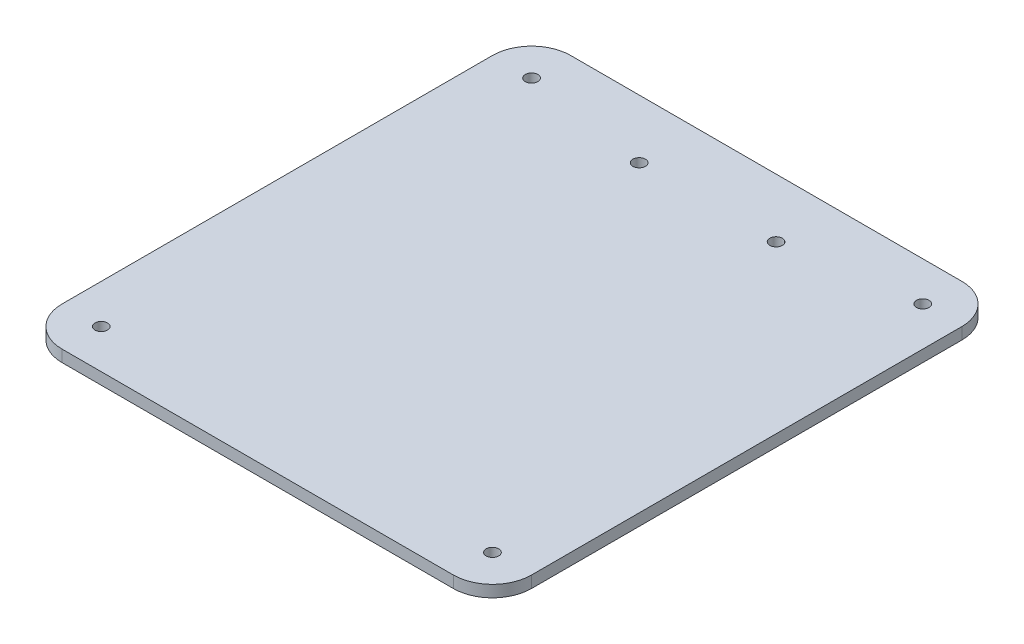
ISO-10303-21;
HEADER;
FILE_DESCRIPTION(('STEP AP214'),'2;1');
FILE_NAME('part.step','',(''),(''),'','','');
FILE_SCHEMA(('AUTOMOTIVE_DESIGN { 1 0 10303 214 1 1 1 1 }'));
ENDSEC;
DATA;
#1=APPLICATION_CONTEXT('core data for automotive mechanical design processes');
#2=APPLICATION_PROTOCOL_DEFINITION('international standard','automotive_design',2000,#1);
#3=PRODUCT_CONTEXT('',#1,'mechanical');
#4=PRODUCT('Part','Part','',(#3));
#5=PRODUCT_RELATED_PRODUCT_CATEGORY('part','',(#4));
#6=PRODUCT_DEFINITION_FORMATION('','',#4);
#7=PRODUCT_DEFINITION_CONTEXT('part definition',#1,'design');
#8=PRODUCT_DEFINITION('design','',#6,#7);
#9=PRODUCT_DEFINITION_SHAPE('','',#8);
#10=(LENGTH_UNIT() NAMED_UNIT(*) SI_UNIT(.MILLI.,.METRE.));
#11=(NAMED_UNIT(*) PLANE_ANGLE_UNIT() SI_UNIT($,.RADIAN.));
#12=(NAMED_UNIT(*) SI_UNIT($,.STERADIAN.) SOLID_ANGLE_UNIT());
#13=UNCERTAINTY_MEASURE_WITH_UNIT(LENGTH_MEASURE(1.E-05),#10,'distance_accuracy_value','');
#14=(GEOMETRIC_REPRESENTATION_CONTEXT(3) GLOBAL_UNCERTAINTY_ASSIGNED_CONTEXT((#13)) GLOBAL_UNIT_ASSIGNED_CONTEXT((#10,
#11,#12)) REPRESENTATION_CONTEXT('',''));
#15=CARTESIAN_POINT('',(0.,0.,0.));
#16=DIRECTION('',(0.,0.,1.));
#17=DIRECTION('',(1.,0.,0.));
#18=AXIS2_PLACEMENT_3D('',#15,#16,#17);
#19=CARTESIAN_POINT('',(-50.,3.,55.));
#20=DIRECTION('',(0.,1.,0.));
#21=DIRECTION('',(0.,0.,1.));
#22=AXIS2_PLACEMENT_3D('',#19,#20,#21);
#23=PLANE('',#22);
#24=CARTESIAN_POINT('',(-17.5,3.,-50.));
#25=DIRECTION('',(0.,1.,0.));
#26=DIRECTION('',(0.,0.,1.));
#27=AXIS2_PLACEMENT_3D('',#24,#25,#26);
#28=CIRCLE('',#27,1.6);
#29=CARTESIAN_POINT('',(-17.5,3.,-48.4));
#30=VERTEX_POINT('',#29);
#31=EDGE_CURVE('E220',#30,#30,#28,.T.);
#32=ORIENTED_EDGE('',*,*,#31,.F.);
#33=EDGE_LOOP('',(#32));
#34=FACE_BOUND('',#33,.T.);
#35=CARTESIAN_POINT('',(17.5,3.,-50.));
#36=DIRECTION('',(0.,1.,0.));
#37=DIRECTION('',(0.,0.,1.));
#38=AXIS2_PLACEMENT_3D('',#35,#36,#37);
#39=CIRCLE('',#38,1.6);
#40=CARTESIAN_POINT('',(17.5,3.,-48.4));
#41=VERTEX_POINT('',#40);
#42=EDGE_CURVE('E217',#41,#41,#39,.T.);
#43=ORIENTED_EDGE('',*,*,#42,.F.);
#44=EDGE_LOOP('',(#43));
#45=FACE_BOUND('',#44,.T.);
#46=CARTESIAN_POINT('',(50.,3.,55.));
#47=DIRECTION('',(0.,1.,0.));
#48=DIRECTION('',(0.,0.,-1.));
#49=AXIS2_PLACEMENT_3D('',#46,#47,#48);
#50=CIRCLE('',#49,1.60000000000001);
#51=CARTESIAN_POINT('',(50.,3.,53.4));
#52=VERTEX_POINT('',#51);
#53=EDGE_CURVE('E199',#52,#52,#50,.T.);
#54=ORIENTED_EDGE('',*,*,#53,.F.);
#55=EDGE_LOOP('',(#54));
#56=FACE_BOUND('',#55,.T.);
#57=CARTESIAN_POINT('',(50.,3.,-55.));
#58=DIRECTION('',(0.,1.,0.));
#59=DIRECTION('',(0.,0.,1.));
#60=AXIS2_PLACEMENT_3D('',#57,#58,#59);
#61=CIRCLE('',#60,1.6);
#62=CARTESIAN_POINT('',(50.,3.,-53.4));
#63=VERTEX_POINT('',#62);
#64=EDGE_CURVE('E145',#63,#63,#61,.T.);
#65=ORIENTED_EDGE('',*,*,#64,.F.);
#66=EDGE_LOOP('',(#65));
#67=FACE_BOUND('',#66,.T.);
#68=CARTESIAN_POINT('',(-50.,3.,55.));
#69=DIRECTION('',(0.,1.,0.));
#70=DIRECTION('',(0.,0.,1.));
#71=AXIS2_PLACEMENT_3D('',#68,#69,#70);
#72=CIRCLE('',#71,9.99999999999999);
#73=CARTESIAN_POINT('',(-60.,3.,54.9999999999999));
#74=VERTEX_POINT('',#73);
#75=CARTESIAN_POINT('',(-49.9999999999999,3.,65.));
#76=VERTEX_POINT('',#75);
#77=EDGE_CURVE('E156',#74,#76,#72,.T.);
#78=ORIENTED_EDGE('',*,*,#77,.T.);
#79=DIRECTION('',(1.,0.,0.));
#80=VECTOR('',#79,1.);
#81=CARTESIAN_POINT('',(-49.9999999999999,3.,65.));
#82=LINE('',#81,#80);
#83=CARTESIAN_POINT('',(49.9999999999999,3.,65.));
#84=VERTEX_POINT('',#83);
#85=EDGE_CURVE('E104',#76,#84,#82,.T.);
#86=ORIENTED_EDGE('',*,*,#85,.T.);
#87=CARTESIAN_POINT('',(50.,3.,55.));
#88=DIRECTION('',(0.,1.,0.));
#89=DIRECTION('',(0.,0.,1.));
#90=AXIS2_PLACEMENT_3D('',#87,#88,#89);
#91=CIRCLE('',#90,9.99999999999999);
#92=CARTESIAN_POINT('',(60.,3.,54.9999999999999));
#93=VERTEX_POINT('',#92);
#94=EDGE_CURVE('E171',#84,#93,#91,.T.);
#95=ORIENTED_EDGE('',*,*,#94,.T.);
#96=DIRECTION('',(0.,0.,-1.));
#97=VECTOR('',#96,1.);
#98=CARTESIAN_POINT('',(60.,3.,-54.9999999999999));
#99=LINE('',#98,#97);
#100=CARTESIAN_POINT('',(60.,3.,-54.9999999999999));
#101=VERTEX_POINT('',#100);
#102=EDGE_CURVE('E184',#93,#101,#99,.T.);
#103=ORIENTED_EDGE('',*,*,#102,.T.);
#104=CARTESIAN_POINT('',(50.,3.,-55.));
#105=DIRECTION('',(0.,1.,0.));
#106=DIRECTION('',(0.,0.,-1.));
#107=AXIS2_PLACEMENT_3D('',#104,#105,#106);
#108=CIRCLE('',#107,9.99999999999999);
#109=CARTESIAN_POINT('',(49.9999999999999,3.,-65.));
#110=VERTEX_POINT('',#109);
#111=EDGE_CURVE('E123',#101,#110,#108,.T.);
#112=ORIENTED_EDGE('',*,*,#111,.T.);
#113=DIRECTION('',(-1.,0.,0.));
#114=VECTOR('',#113,1.);
#115=CARTESIAN_POINT('',(-49.9999999999999,3.,-65.));
#116=LINE('',#115,#114);
#117=CARTESIAN_POINT('',(-49.9999999999999,3.,-65.));
#118=VERTEX_POINT('',#117);
#119=EDGE_CURVE('E117',#110,#118,#116,.T.);
#120=ORIENTED_EDGE('',*,*,#119,.T.);
#121=CARTESIAN_POINT('',(-50.,3.,-55.));
#122=DIRECTION('',(0.,1.,0.));
#123=DIRECTION('',(0.,0.,1.));
#124=AXIS2_PLACEMENT_3D('',#121,#122,#123);
#125=CIRCLE('',#124,9.99999999999999);
#126=CARTESIAN_POINT('',(-60.,3.,-54.9999999999999));
#127=VERTEX_POINT('',#126);
#128=EDGE_CURVE('E121',#118,#127,#125,.T.);
#129=ORIENTED_EDGE('',*,*,#128,.T.);
#130=DIRECTION('',(0.,0.,1.));
#131=VECTOR('',#130,1.);
#132=CARTESIAN_POINT('',(-60.,3.,-54.9999999999999));
#133=LINE('',#132,#131);
#134=EDGE_CURVE('E61',#127,#74,#133,.T.);
#135=ORIENTED_EDGE('',*,*,#134,.T.);
#136=EDGE_LOOP('',(#78,#86,#95,#103,#112,#120,#129,#135));
#137=FACE_BOUND('',#136,.T.);
#138=CARTESIAN_POINT('',(-50.,3.,-55.));
#139=DIRECTION('',(0.,1.,0.));
#140=DIRECTION('',(0.,0.,-1.));
#141=AXIS2_PLACEMENT_3D('',#138,#139,#140);
#142=CIRCLE('',#141,1.59999999999999);
#143=CARTESIAN_POINT('',(-50.,3.,-56.6));
#144=VERTEX_POINT('',#143);
#145=EDGE_CURVE('E193',#144,#144,#142,.T.);
#146=ORIENTED_EDGE('',*,*,#145,.F.);
#147=EDGE_LOOP('',(#146));
#148=FACE_BOUND('',#147,.T.);
#149=CARTESIAN_POINT('',(-50.,3.,55.));
#150=DIRECTION('',(0.,1.,0.));
#151=DIRECTION('',(0.,0.,1.));
#152=AXIS2_PLACEMENT_3D('',#149,#150,#151);
#153=CIRCLE('',#152,1.6);
#154=CARTESIAN_POINT('',(-50.,3.,56.6));
#155=VERTEX_POINT('',#154);
#156=EDGE_CURVE('E205',#155,#155,#153,.T.);
#157=ORIENTED_EDGE('',*,*,#156,.F.);
#158=EDGE_LOOP('',(#157));
#159=FACE_BOUND('',#158,.T.);
#160=ADVANCED_FACE('F44',(#34,#45,#56,#67,#137,#148,#159),#23,.T.);
#161=CARTESIAN_POINT('',(-50.,0.,55.));
#162=DIRECTION('',(0.,1.,0.));
#163=DIRECTION('',(0.,0.,1.));
#164=AXIS2_PLACEMENT_3D('',#161,#162,#163);
#165=PLANE('',#164);
#166=CARTESIAN_POINT('',(-17.5,0.,-50.));
#167=DIRECTION('',(0.,1.,0.));
#168=DIRECTION('',(0.,0.,1.));
#169=AXIS2_PLACEMENT_3D('',#166,#167,#168);
#170=CIRCLE('',#169,1.6);
#171=CARTESIAN_POINT('',(-17.5,0.,-48.4));
#172=VERTEX_POINT('',#171);
#173=EDGE_CURVE('E211',#172,#172,#170,.T.);
#174=ORIENTED_EDGE('',*,*,#173,.T.);
#175=EDGE_LOOP('',(#174));
#176=FACE_BOUND('',#175,.T.);
#177=CARTESIAN_POINT('',(17.5,0.,-50.));
#178=DIRECTION('',(0.,1.,0.));
#179=DIRECTION('',(0.,0.,1.));
#180=AXIS2_PLACEMENT_3D('',#177,#178,#179);
#181=CIRCLE('',#180,1.6);
#182=CARTESIAN_POINT('',(17.5,0.,-48.4));
#183=VERTEX_POINT('',#182);
#184=EDGE_CURVE('E214',#183,#183,#181,.T.);
#185=ORIENTED_EDGE('',*,*,#184,.T.);
#186=EDGE_LOOP('',(#185));
#187=FACE_BOUND('',#186,.T.);
#188=CARTESIAN_POINT('',(-50.,0.,55.));
#189=DIRECTION('',(0.,1.,0.));
#190=DIRECTION('',(0.,0.,1.));
#191=AXIS2_PLACEMENT_3D('',#188,#189,#190);
#192=CIRCLE('',#191,9.99999999999999);
#193=CARTESIAN_POINT('',(-60.,0.,54.9999999999999));
#194=VERTEX_POINT('',#193);
#195=CARTESIAN_POINT('',(-49.9999999999999,0.,65.));
#196=VERTEX_POINT('',#195);
#197=EDGE_CURVE('E141',#194,#196,#192,.T.);
#198=ORIENTED_EDGE('',*,*,#197,.F.);
#199=DIRECTION('',(0.,0.,1.));
#200=VECTOR('',#199,1.);
#201=CARTESIAN_POINT('',(-60.,0.,-54.9999999999999));
#202=LINE('',#201,#200);
#203=CARTESIAN_POINT('',(-60.,0.,-54.9999999999999));
#204=VERTEX_POINT('',#203);
#205=EDGE_CURVE('E96',#204,#194,#202,.T.);
#206=ORIENTED_EDGE('',*,*,#205,.F.);
#207=CARTESIAN_POINT('',(-50.,0.,-55.));
#208=DIRECTION('',(0.,1.,0.));
#209=DIRECTION('',(0.,0.,1.));
#210=AXIS2_PLACEMENT_3D('',#207,#208,#209);
#211=CIRCLE('',#210,9.99999999999999);
#212=CARTESIAN_POINT('',(-49.9999999999999,0.,-65.));
#213=VERTEX_POINT('',#212);
#214=EDGE_CURVE('E90',#213,#204,#211,.T.);
#215=ORIENTED_EDGE('',*,*,#214,.F.);
#216=DIRECTION('',(-1.,0.,0.));
#217=VECTOR('',#216,1.);
#218=CARTESIAN_POINT('',(-49.9999999999999,0.,-65.));
#219=LINE('',#218,#217);
#220=CARTESIAN_POINT('',(49.9999999999999,0.,-65.));
#221=VERTEX_POINT('',#220);
#222=EDGE_CURVE('E131',#221,#213,#219,.T.);
#223=ORIENTED_EDGE('',*,*,#222,.F.);
#224=CARTESIAN_POINT('',(50.,0.,-55.));
#225=DIRECTION('',(0.,1.,0.));
#226=DIRECTION('',(0.,0.,-1.));
#227=AXIS2_PLACEMENT_3D('',#224,#225,#226);
#228=CIRCLE('',#227,9.99999999999999);
#229=CARTESIAN_POINT('',(60.,0.,-54.9999999999999));
#230=VERTEX_POINT('',#229);
#231=EDGE_CURVE('E151',#230,#221,#228,.T.);
#232=ORIENTED_EDGE('',*,*,#231,.F.);
#233=DIRECTION('',(0.,0.,-1.));
#234=VECTOR('',#233,1.);
#235=CARTESIAN_POINT('',(60.,0.,-54.9999999999999));
#236=LINE('',#235,#234);
#237=CARTESIAN_POINT('',(60.,0.,54.9999999999999));
#238=VERTEX_POINT('',#237);
#239=EDGE_CURVE('E149',#238,#230,#236,.T.);
#240=ORIENTED_EDGE('',*,*,#239,.F.);
#241=CARTESIAN_POINT('',(50.,0.,55.));
#242=DIRECTION('',(0.,1.,0.));
#243=DIRECTION('',(0.,0.,1.));
#244=AXIS2_PLACEMENT_3D('',#241,#242,#243);
#245=CIRCLE('',#244,9.99999999999999);
#246=CARTESIAN_POINT('',(49.9999999999999,0.,65.));
#247=VERTEX_POINT('',#246);
#248=EDGE_CURVE('E147',#247,#238,#245,.T.);
#249=ORIENTED_EDGE('',*,*,#248,.F.);
#250=DIRECTION('',(1.,0.,0.));
#251=VECTOR('',#250,1.);
#252=CARTESIAN_POINT('',(-49.9999999999999,0.,65.));
#253=LINE('',#252,#251);
#254=EDGE_CURVE('E144',#196,#247,#253,.T.);
#255=ORIENTED_EDGE('',*,*,#254,.F.);
#256=EDGE_LOOP('',(#198,#206,#215,#223,#232,#240,#249,#255));
#257=FACE_BOUND('',#256,.T.);
#258=CARTESIAN_POINT('',(50.,0.,-55.));
#259=DIRECTION('',(0.,1.,0.));
#260=DIRECTION('',(0.,0.,1.));
#261=AXIS2_PLACEMENT_3D('',#258,#259,#260);
#262=CIRCLE('',#261,1.6);
#263=CARTESIAN_POINT('',(50.,0.,-53.4));
#264=VERTEX_POINT('',#263);
#265=EDGE_CURVE('E190',#264,#264,#262,.T.);
#266=ORIENTED_EDGE('',*,*,#265,.T.);
#267=EDGE_LOOP('',(#266));
#268=FACE_BOUND('',#267,.T.);
#269=CARTESIAN_POINT('',(-50.,0.,-55.));
#270=DIRECTION('',(0.,1.,0.));
#271=DIRECTION('',(0.,0.,-1.));
#272=AXIS2_PLACEMENT_3D('',#269,#270,#271);
#273=CIRCLE('',#272,1.59999999999999);
#274=CARTESIAN_POINT('',(-50.,0.,-56.6));
#275=VERTEX_POINT('',#274);
#276=EDGE_CURVE('E196',#275,#275,#273,.T.);
#277=ORIENTED_EDGE('',*,*,#276,.T.);
#278=EDGE_LOOP('',(#277));
#279=FACE_BOUND('',#278,.T.);
#280=CARTESIAN_POINT('',(50.,0.,55.));
#281=DIRECTION('',(0.,1.,0.));
#282=DIRECTION('',(0.,0.,-1.));
#283=AXIS2_PLACEMENT_3D('',#280,#281,#282);
#284=CIRCLE('',#283,1.60000000000001);
#285=CARTESIAN_POINT('',(50.,0.,53.4));
#286=VERTEX_POINT('',#285);
#287=EDGE_CURVE('E202',#286,#286,#284,.T.);
#288=ORIENTED_EDGE('',*,*,#287,.T.);
#289=EDGE_LOOP('',(#288));
#290=FACE_BOUND('',#289,.T.);
#291=CARTESIAN_POINT('',(-50.,0.,55.));
#292=DIRECTION('',(0.,1.,0.));
#293=DIRECTION('',(0.,0.,1.));
#294=AXIS2_PLACEMENT_3D('',#291,#292,#293);
#295=CIRCLE('',#294,1.6);
#296=CARTESIAN_POINT('',(-50.,0.,56.6));
#297=VERTEX_POINT('',#296);
#298=EDGE_CURVE('E208',#297,#297,#295,.T.);
#299=ORIENTED_EDGE('',*,*,#298,.T.);
#300=EDGE_LOOP('',(#299));
#301=FACE_BOUND('',#300,.T.);
#302=ADVANCED_FACE('F175',(#176,#187,#257,#268,#279,#290,#301),#165,.F.);
#303=CARTESIAN_POINT('',(-50.,3.,55.));
#304=DIRECTION('',(0.,-1.,0.));
#305=DIRECTION('',(0.,0.,-1.));
#306=AXIS2_PLACEMENT_3D('',#303,#304,#305);
#307=CYLINDRICAL_SURFACE('',#306,9.99999999999999);
#308=ORIENTED_EDGE('',*,*,#197,.T.);
#309=DIRECTION('',(0.,-1.,0.));
#310=VECTOR('',#309,1.);
#311=CARTESIAN_POINT('',(-49.9999999999999,3.,65.));
#312=LINE('',#311,#310);
#313=EDGE_CURVE('E11',#76,#196,#312,.T.);
#314=ORIENTED_EDGE('',*,*,#313,.F.);
#315=ORIENTED_EDGE('',*,*,#77,.F.);
#316=DIRECTION('',(0.,-1.,0.));
#317=VECTOR('',#316,1.);
#318=CARTESIAN_POINT('',(-60.,3.,54.9999999999999));
#319=LINE('',#318,#317);
#320=EDGE_CURVE('E137',#74,#194,#319,.T.);
#321=ORIENTED_EDGE('',*,*,#320,.T.);
#322=EDGE_LOOP('',(#308,#314,#315,#321));
#323=FACE_BOUND('',#322,.T.);
#324=ADVANCED_FACE('F46',(#323),#307,.T.);
#325=CARTESIAN_POINT('',(-49.9999999999999,3.,65.));
#326=DIRECTION('',(0.,0.,-1.));
#327=DIRECTION('',(-1.,0.,0.));
#328=AXIS2_PLACEMENT_3D('',#325,#326,#327);
#329=PLANE('',#328);
#330=ORIENTED_EDGE('',*,*,#254,.T.);
#331=DIRECTION('',(0.,-1.,0.));
#332=VECTOR('',#331,1.);
#333=CARTESIAN_POINT('',(49.9999999999999,3.,65.));
#334=LINE('',#333,#332);
#335=EDGE_CURVE('E53',#84,#247,#334,.T.);
#336=ORIENTED_EDGE('',*,*,#335,.F.);
#337=ORIENTED_EDGE('',*,*,#85,.F.);
#338=ORIENTED_EDGE('',*,*,#313,.T.);
#339=EDGE_LOOP('',(#330,#336,#337,#338));
#340=FACE_BOUND('',#339,.T.);
#341=ADVANCED_FACE('F288',(#340),#329,.F.);
#342=CARTESIAN_POINT('',(50.,3.,55.));
#343=DIRECTION('',(0.,-1.,0.));
#344=DIRECTION('',(0.,0.,-1.));
#345=AXIS2_PLACEMENT_3D('',#342,#343,#344);
#346=CYLINDRICAL_SURFACE('',#345,9.99999999999999);
#347=ORIENTED_EDGE('',*,*,#248,.T.);
#348=DIRECTION('',(0.,-1.,0.));
#349=VECTOR('',#348,1.);
#350=CARTESIAN_POINT('',(60.,3.,54.9999999999999));
#351=LINE('',#350,#349);
#352=EDGE_CURVE('E163',#93,#238,#351,.T.);
#353=ORIENTED_EDGE('',*,*,#352,.F.);
#354=ORIENTED_EDGE('',*,*,#94,.F.);
#355=ORIENTED_EDGE('',*,*,#335,.T.);
#356=EDGE_LOOP('',(#347,#353,#354,#355));
#357=FACE_BOUND('',#356,.T.);
#358=ADVANCED_FACE('F169',(#357),#346,.T.);
#359=CARTESIAN_POINT('',(60.,3.,-54.9999999999999));
#360=DIRECTION('',(-1.,0.,0.));
#361=DIRECTION('',(0.,0.,1.));
#362=AXIS2_PLACEMENT_3D('',#359,#360,#361);
#363=PLANE('',#362);
#364=ORIENTED_EDGE('',*,*,#239,.T.);
#365=DIRECTION('',(0.,-1.,0.));
#366=VECTOR('',#365,1.);
#367=CARTESIAN_POINT('',(60.,3.,-54.9999999999999));
#368=LINE('',#367,#366);
#369=EDGE_CURVE('E160',#101,#230,#368,.T.);
#370=ORIENTED_EDGE('',*,*,#369,.F.);
#371=ORIENTED_EDGE('',*,*,#102,.F.);
#372=ORIENTED_EDGE('',*,*,#352,.T.);
#373=EDGE_LOOP('',(#364,#370,#371,#372));
#374=FACE_BOUND('',#373,.T.);
#375=ADVANCED_FACE('F180',(#374),#363,.F.);
#376=CARTESIAN_POINT('',(50.,3.,-55.));
#377=DIRECTION('',(0.,-1.,0.));
#378=DIRECTION('',(0.,0.,-1.));
#379=AXIS2_PLACEMENT_3D('',#376,#377,#378);
#380=CYLINDRICAL_SURFACE('',#379,9.99999999999999);
#381=ORIENTED_EDGE('',*,*,#231,.T.);
#382=DIRECTION('',(0.,-1.,0.));
#383=VECTOR('',#382,1.);
#384=CARTESIAN_POINT('',(49.9999999999999,3.,-65.));
#385=LINE('',#384,#383);
#386=EDGE_CURVE('E132',#110,#221,#385,.T.);
#387=ORIENTED_EDGE('',*,*,#386,.F.);
#388=ORIENTED_EDGE('',*,*,#111,.F.);
#389=ORIENTED_EDGE('',*,*,#369,.T.);
#390=EDGE_LOOP('',(#381,#387,#388,#389));
#391=FACE_BOUND('',#390,.T.);
#392=ADVANCED_FACE('F183',(#391),#380,.T.);
#393=CARTESIAN_POINT('',(-49.9999999999999,3.,-65.));
#394=DIRECTION('',(0.,0.,1.));
#395=DIRECTION('',(1.,0.,0.));
#396=AXIS2_PLACEMENT_3D('',#393,#394,#395);
#397=PLANE('',#396);
#398=ORIENTED_EDGE('',*,*,#222,.T.);
#399=DIRECTION('',(0.,-1.,0.));
#400=VECTOR('',#399,1.);
#401=CARTESIAN_POINT('',(-49.9999999999999,3.,-65.));
#402=LINE('',#401,#400);
#403=EDGE_CURVE('E128',#118,#213,#402,.T.);
#404=ORIENTED_EDGE('',*,*,#403,.F.);
#405=ORIENTED_EDGE('',*,*,#119,.F.);
#406=ORIENTED_EDGE('',*,*,#386,.T.);
#407=EDGE_LOOP('',(#398,#404,#405,#406));
#408=FACE_BOUND('',#407,.T.);
#409=ADVANCED_FACE('F129',(#408),#397,.F.);
#410=CARTESIAN_POINT('',(-50.,3.,-55.));
#411=DIRECTION('',(0.,-1.,0.));
#412=DIRECTION('',(0.,0.,-1.));
#413=AXIS2_PLACEMENT_3D('',#410,#411,#412);
#414=CYLINDRICAL_SURFACE('',#413,9.99999999999999);
#415=ORIENTED_EDGE('',*,*,#214,.T.);
#416=DIRECTION('',(0.,-1.,0.));
#417=VECTOR('',#416,1.);
#418=CARTESIAN_POINT('',(-60.,3.,-54.9999999999999));
#419=LINE('',#418,#417);
#420=EDGE_CURVE('E133',#127,#204,#419,.T.);
#421=ORIENTED_EDGE('',*,*,#420,.F.);
#422=ORIENTED_EDGE('',*,*,#128,.F.);
#423=ORIENTED_EDGE('',*,*,#403,.T.);
#424=EDGE_LOOP('',(#415,#421,#422,#423));
#425=FACE_BOUND('',#424,.T.);
#426=ADVANCED_FACE('F135',(#425),#414,.T.);
#427=CARTESIAN_POINT('',(-60.,3.,-54.9999999999999));
#428=DIRECTION('',(1.,0.,0.));
#429=DIRECTION('',(0.,0.,-1.));
#430=AXIS2_PLACEMENT_3D('',#427,#428,#429);
#431=PLANE('',#430);
#432=ORIENTED_EDGE('',*,*,#205,.T.);
#433=ORIENTED_EDGE('',*,*,#320,.F.);
#434=ORIENTED_EDGE('',*,*,#134,.F.);
#435=ORIENTED_EDGE('',*,*,#420,.T.);
#436=EDGE_LOOP('',(#432,#433,#434,#435));
#437=FACE_BOUND('',#436,.T.);
#438=ADVANCED_FACE('F248',(#437),#431,.F.);
#439=CARTESIAN_POINT('',(50.,3.,-55.));
#440=DIRECTION('',(0.,-1.,0.));
#441=DIRECTION('',(0.,0.,-1.));
#442=AXIS2_PLACEMENT_3D('',#439,#440,#441);
#443=CYLINDRICAL_SURFACE('',#442,1.6);
#444=ORIENTED_EDGE('',*,*,#64,.T.);
#445=EDGE_LOOP('',(#444));
#446=FACE_BOUND('',#445,.T.);
#447=ORIENTED_EDGE('',*,*,#265,.F.);
#448=EDGE_LOOP('',(#447));
#449=FACE_BOUND('',#448,.T.);
#450=ADVANCED_FACE('F244',(#446,#449),#443,.F.);
#451=CARTESIAN_POINT('',(-50.,3.,-55.));
#452=DIRECTION('',(0.,-1.,0.));
#453=DIRECTION('',(0.,0.,-1.));
#454=AXIS2_PLACEMENT_3D('',#451,#452,#453);
#455=CYLINDRICAL_SURFACE('',#454,1.59999999999999);
#456=ORIENTED_EDGE('',*,*,#145,.T.);
#457=EDGE_LOOP('',(#456));
#458=FACE_BOUND('',#457,.T.);
#459=ORIENTED_EDGE('',*,*,#276,.F.);
#460=EDGE_LOOP('',(#459));
#461=FACE_BOUND('',#460,.T.);
#462=ADVANCED_FACE('F247',(#458,#461),#455,.F.);
#463=CARTESIAN_POINT('',(50.,3.,55.));
#464=DIRECTION('',(0.,-1.,0.));
#465=DIRECTION('',(0.,0.,-1.));
#466=AXIS2_PLACEMENT_3D('',#463,#464,#465);
#467=CYLINDRICAL_SURFACE('',#466,1.60000000000001);
#468=ORIENTED_EDGE('',*,*,#53,.T.);
#469=EDGE_LOOP('',(#468));
#470=FACE_BOUND('',#469,.T.);
#471=ORIENTED_EDGE('',*,*,#287,.F.);
#472=EDGE_LOOP('',(#471));
#473=FACE_BOUND('',#472,.T.);
#474=ADVANCED_FACE('F262',(#470,#473),#467,.F.);
#475=CARTESIAN_POINT('',(-50.,3.,55.));
#476=DIRECTION('',(0.,-1.,0.));
#477=DIRECTION('',(0.,0.,-1.));
#478=AXIS2_PLACEMENT_3D('',#475,#476,#477);
#479=CYLINDRICAL_SURFACE('',#478,1.6);
#480=ORIENTED_EDGE('',*,*,#156,.T.);
#481=EDGE_LOOP('',(#480));
#482=FACE_BOUND('',#481,.T.);
#483=ORIENTED_EDGE('',*,*,#298,.F.);
#484=EDGE_LOOP('',(#483));
#485=FACE_BOUND('',#484,.T.);
#486=ADVANCED_FACE('F260',(#482,#485),#479,.F.);
#487=CARTESIAN_POINT('',(17.5,0.,-50.));
#488=DIRECTION('',(0.,1.,0.));
#489=DIRECTION('',(0.,0.,1.));
#490=AXIS2_PLACEMENT_3D('',#487,#488,#489);
#491=CYLINDRICAL_SURFACE('',#490,1.6);
#492=ORIENTED_EDGE('',*,*,#184,.F.);
#493=EDGE_LOOP('',(#492));
#494=FACE_BOUND('',#493,.T.);
#495=ORIENTED_EDGE('',*,*,#42,.T.);
#496=EDGE_LOOP('',(#495));
#497=FACE_BOUND('',#496,.T.);
#498=ADVANCED_FACE('F231',(#494,#497),#491,.F.);
#499=CARTESIAN_POINT('',(-17.5,0.,-50.));
#500=DIRECTION('',(0.,1.,0.));
#501=DIRECTION('',(0.,0.,1.));
#502=AXIS2_PLACEMENT_3D('',#499,#500,#501);
#503=CYLINDRICAL_SURFACE('',#502,1.6);
#504=ORIENTED_EDGE('',*,*,#173,.F.);
#505=EDGE_LOOP('',(#504));
#506=FACE_BOUND('',#505,.T.);
#507=ORIENTED_EDGE('',*,*,#31,.T.);
#508=EDGE_LOOP('',(#507));
#509=FACE_BOUND('',#508,.T.);
#510=ADVANCED_FACE('F228',(#506,#509),#503,.F.);
#511=CLOSED_SHELL('',(#160,#302,#324,#341,#358,#375,#392,#409,#426,#438,#450,#462,#474,#486,
#498,#510));
#512=MANIFOLD_SOLID_BREP('B2',#511);
#513=ADVANCED_BREP_SHAPE_REPRESENTATION('',(#18,#512),#14);
#514=SHAPE_DEFINITION_REPRESENTATION(#9,#513);
ENDSEC;
END-ISO-10303-21;
